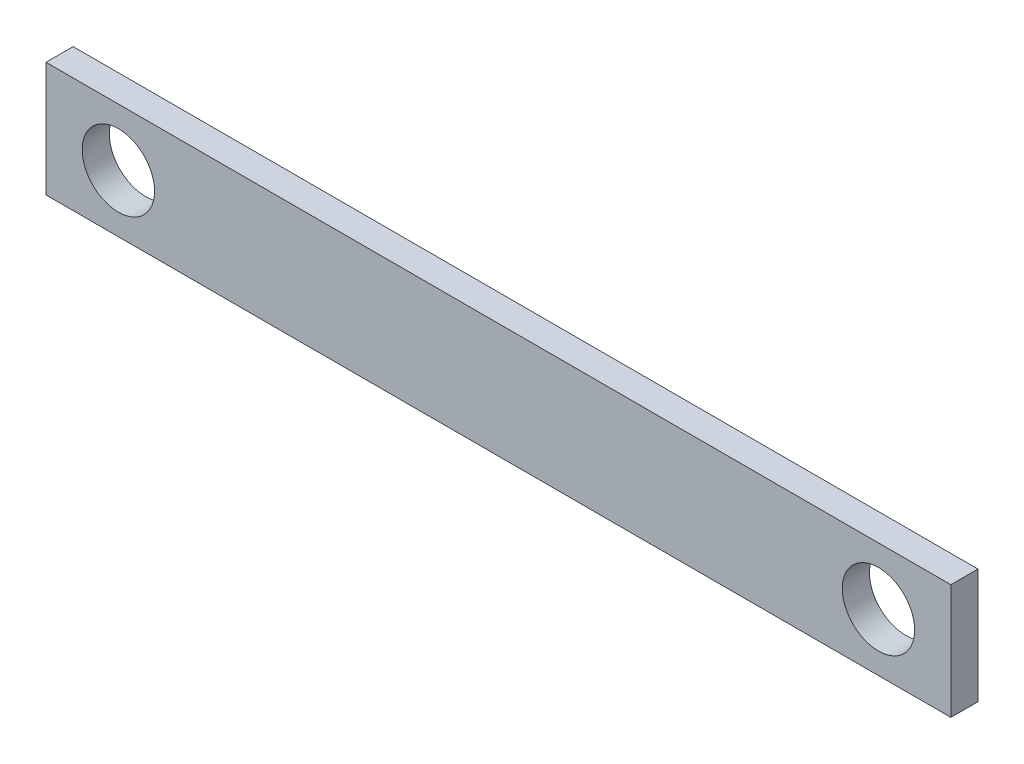
ISO-10303-21;
HEADER;
FILE_DESCRIPTION(('STEP AP214'),'2;1');
FILE_NAME('part.step','',(''),(''),'','','');
FILE_SCHEMA(('AUTOMOTIVE_DESIGN { 1 0 10303 214 1 1 1 1 }'));
ENDSEC;
DATA;
#1=APPLICATION_CONTEXT('core data for automotive mechanical design processes');
#2=APPLICATION_PROTOCOL_DEFINITION('international standard','automotive_design',2000,#1);
#3=PRODUCT_CONTEXT('',#1,'mechanical');
#4=PRODUCT('Part','Part','',(#3));
#5=PRODUCT_RELATED_PRODUCT_CATEGORY('part','',(#4));
#6=PRODUCT_DEFINITION_FORMATION('','',#4);
#7=PRODUCT_DEFINITION_CONTEXT('part definition',#1,'design');
#8=PRODUCT_DEFINITION('design','',#6,#7);
#9=PRODUCT_DEFINITION_SHAPE('','',#8);
#10=(LENGTH_UNIT() NAMED_UNIT(*) SI_UNIT(.MILLI.,.METRE.));
#11=(NAMED_UNIT(*) PLANE_ANGLE_UNIT() SI_UNIT($,.RADIAN.));
#12=(NAMED_UNIT(*) SI_UNIT($,.STERADIAN.) SOLID_ANGLE_UNIT());
#13=UNCERTAINTY_MEASURE_WITH_UNIT(LENGTH_MEASURE(1.E-05),#10,'distance_accuracy_value','');
#14=(GEOMETRIC_REPRESENTATION_CONTEXT(3) GLOBAL_UNCERTAINTY_ASSIGNED_CONTEXT((#13)) GLOBAL_UNIT_ASSIGNED_CONTEXT((#10,
#11,#12)) REPRESENTATION_CONTEXT('',''));
#15=CARTESIAN_POINT('',(0.,0.,0.));
#16=DIRECTION('',(0.,0.,1.));
#17=DIRECTION('',(1.,0.,0.));
#18=AXIS2_PLACEMENT_3D('',#15,#16,#17);
#19=CARTESIAN_POINT('',(0.,0.,3.));
#20=DIRECTION('',(0.,0.,1.));
#21=DIRECTION('',(1.,0.,0.));
#22=AXIS2_PLACEMENT_3D('',#19,#20,#21);
#23=PLANE('',#22);
#24=CARTESIAN_POINT('',(-42.,0.,3.));
#25=DIRECTION('',(0.,0.,1.));
#26=DIRECTION('',(1.,0.,0.));
#27=AXIS2_PLACEMENT_3D('',#24,#25,#26);
#28=CIRCLE('',#27,4.00000000000001);
#29=CARTESIAN_POINT('',(-38.,0.,3.));
#30=VERTEX_POINT('',#29);
#31=EDGE_CURVE('E100',#30,#30,#28,.T.);
#32=ORIENTED_EDGE('',*,*,#31,.F.);
#33=EDGE_LOOP('',(#32));
#34=FACE_BOUND('',#33,.T.);
#35=DIRECTION('',(0.,-1.,0.));
#36=VECTOR('',#35,1.);
#37=CARTESIAN_POINT('',(-50.,-6.35000000000001,3.));
#38=LINE('',#37,#36);
#39=CARTESIAN_POINT('',(-50.,6.34999999999999,3.));
#40=VERTEX_POINT('',#39);
#41=CARTESIAN_POINT('',(-50.,-6.35000000000001,3.));
#42=VERTEX_POINT('',#41);
#43=EDGE_CURVE('E85',#40,#42,#38,.T.);
#44=ORIENTED_EDGE('',*,*,#43,.T.);
#45=DIRECTION('',(1.,0.,0.));
#46=VECTOR('',#45,1.);
#47=CARTESIAN_POINT('',(50.,-6.34999999999999,3.));
#48=LINE('',#47,#46);
#49=CARTESIAN_POINT('',(50.,-6.34999999999999,3.));
#50=VERTEX_POINT('',#49);
#51=EDGE_CURVE('E80',#42,#50,#48,.T.);
#52=ORIENTED_EDGE('',*,*,#51,.T.);
#53=DIRECTION('',(0.,1.,0.));
#54=VECTOR('',#53,1.);
#55=CARTESIAN_POINT('',(50.,-6.34999999999999,3.));
#56=LINE('',#55,#54);
#57=CARTESIAN_POINT('',(50.,6.35000000000001,3.));
#58=VERTEX_POINT('',#57);
#59=EDGE_CURVE('E83',#50,#58,#56,.T.);
#60=ORIENTED_EDGE('',*,*,#59,.T.);
#61=DIRECTION('',(-1.,0.,0.));
#62=VECTOR('',#61,1.);
#63=CARTESIAN_POINT('',(50.,6.35000000000001,3.));
#64=LINE('',#63,#62);
#65=EDGE_CURVE('E50',#58,#40,#64,.T.);
#66=ORIENTED_EDGE('',*,*,#65,.T.);
#67=EDGE_LOOP('',(#44,#52,#60,#66));
#68=FACE_BOUND('',#67,.T.);
#69=CARTESIAN_POINT('',(42.,0.,3.));
#70=DIRECTION('',(0.,0.,1.));
#71=DIRECTION('',(-1.,0.,0.));
#72=AXIS2_PLACEMENT_3D('',#69,#70,#71);
#73=CIRCLE('',#72,4.00000000000001);
#74=CARTESIAN_POINT('',(38.,0.,3.));
#75=VERTEX_POINT('',#74);
#76=EDGE_CURVE('E115',#75,#75,#73,.T.);
#77=ORIENTED_EDGE('',*,*,#76,.F.);
#78=EDGE_LOOP('',(#77));
#79=FACE_BOUND('',#78,.T.);
#80=ADVANCED_FACE('F33',(#34,#68,#79),#23,.T.);
#81=CARTESIAN_POINT('',(0.,0.,0.));
#82=DIRECTION('',(0.,0.,1.));
#83=DIRECTION('',(1.,0.,0.));
#84=AXIS2_PLACEMENT_3D('',#81,#82,#83);
#85=PLANE('',#84);
#86=DIRECTION('',(0.,-1.,0.));
#87=VECTOR('',#86,1.);
#88=CARTESIAN_POINT('',(-50.,-6.35000000000001,0.));
#89=LINE('',#88,#87);
#90=CARTESIAN_POINT('',(-50.,6.34999999999999,0.));
#91=VERTEX_POINT('',#90);
#92=CARTESIAN_POINT('',(-50.,-6.35000000000001,0.));
#93=VERTEX_POINT('',#92);
#94=EDGE_CURVE('E97',#91,#93,#89,.T.);
#95=ORIENTED_EDGE('',*,*,#94,.F.);
#96=DIRECTION('',(-1.,0.,0.));
#97=VECTOR('',#96,1.);
#98=CARTESIAN_POINT('',(50.,6.35000000000001,0.));
#99=LINE('',#98,#97);
#100=CARTESIAN_POINT('',(50.,6.35000000000001,0.));
#101=VERTEX_POINT('',#100);
#102=EDGE_CURVE('E73',#101,#91,#99,.T.);
#103=ORIENTED_EDGE('',*,*,#102,.F.);
#104=DIRECTION('',(0.,1.,0.));
#105=VECTOR('',#104,1.);
#106=CARTESIAN_POINT('',(50.,-6.34999999999999,0.));
#107=LINE('',#106,#105);
#108=CARTESIAN_POINT('',(50.,-6.34999999999999,0.));
#109=VERTEX_POINT('',#108);
#110=EDGE_CURVE('E67',#109,#101,#107,.T.);
#111=ORIENTED_EDGE('',*,*,#110,.F.);
#112=DIRECTION('',(1.,0.,0.));
#113=VECTOR('',#112,1.);
#114=CARTESIAN_POINT('',(50.,-6.34999999999999,0.));
#115=LINE('',#114,#113);
#116=EDGE_CURVE('E89',#93,#109,#115,.T.);
#117=ORIENTED_EDGE('',*,*,#116,.F.);
#118=EDGE_LOOP('',(#95,#103,#111,#117));
#119=FACE_BOUND('',#118,.T.);
#120=CARTESIAN_POINT('',(-42.,0.,0.));
#121=DIRECTION('',(0.,0.,1.));
#122=DIRECTION('',(1.,0.,0.));
#123=AXIS2_PLACEMENT_3D('',#120,#121,#122);
#124=CIRCLE('',#123,4.00000000000001);
#125=CARTESIAN_POINT('',(-38.,0.,0.));
#126=VERTEX_POINT('',#125);
#127=EDGE_CURVE('E112',#126,#126,#124,.T.);
#128=ORIENTED_EDGE('',*,*,#127,.T.);
#129=EDGE_LOOP('',(#128));
#130=FACE_BOUND('',#129,.T.);
#131=CARTESIAN_POINT('',(42.,0.,0.));
#132=DIRECTION('',(0.,0.,1.));
#133=DIRECTION('',(-1.,0.,0.));
#134=AXIS2_PLACEMENT_3D('',#131,#132,#133);
#135=CIRCLE('',#134,4.00000000000001);
#136=CARTESIAN_POINT('',(38.,0.,0.));
#137=VERTEX_POINT('',#136);
#138=EDGE_CURVE('E118',#137,#137,#135,.T.);
#139=ORIENTED_EDGE('',*,*,#138,.T.);
#140=EDGE_LOOP('',(#139));
#141=FACE_BOUND('',#140,.T.);
#142=ADVANCED_FACE('F108',(#119,#130,#141),#85,.F.);
#143=CARTESIAN_POINT('',(-50.,-6.35000000000001,3.));
#144=DIRECTION('',(1.,0.,0.));
#145=DIRECTION('',(0.,0.,-1.));
#146=AXIS2_PLACEMENT_3D('',#143,#144,#145);
#147=PLANE('',#146);
#148=ORIENTED_EDGE('',*,*,#94,.T.);
#149=DIRECTION('',(0.,0.,-1.));
#150=VECTOR('',#149,1.);
#151=CARTESIAN_POINT('',(-50.,-6.35000000000001,3.));
#152=LINE('',#151,#150);
#153=EDGE_CURVE('E11',#42,#93,#152,.T.);
#154=ORIENTED_EDGE('',*,*,#153,.F.);
#155=ORIENTED_EDGE('',*,*,#43,.F.);
#156=DIRECTION('',(0.,0.,-1.));
#157=VECTOR('',#156,1.);
#158=CARTESIAN_POINT('',(-50.,6.34999999999999,3.));
#159=LINE('',#158,#157);
#160=EDGE_CURVE('E93',#40,#91,#159,.T.);
#161=ORIENTED_EDGE('',*,*,#160,.T.);
#162=EDGE_LOOP('',(#148,#154,#155,#161));
#163=FACE_BOUND('',#162,.T.);
#164=ADVANCED_FACE('F35',(#163),#147,.F.);
#165=CARTESIAN_POINT('',(50.,-6.34999999999999,3.));
#166=DIRECTION('',(0.,1.,0.));
#167=DIRECTION('',(-1.,0.,0.));
#168=AXIS2_PLACEMENT_3D('',#165,#166,#167);
#169=PLANE('',#168);
#170=ORIENTED_EDGE('',*,*,#116,.T.);
#171=DIRECTION('',(0.,0.,-1.));
#172=VECTOR('',#171,1.);
#173=CARTESIAN_POINT('',(50.,-6.34999999999999,3.));
#174=LINE('',#173,#172);
#175=EDGE_CURVE('E42',#50,#109,#174,.T.);
#176=ORIENTED_EDGE('',*,*,#175,.F.);
#177=ORIENTED_EDGE('',*,*,#51,.F.);
#178=ORIENTED_EDGE('',*,*,#153,.T.);
#179=EDGE_LOOP('',(#170,#176,#177,#178));
#180=FACE_BOUND('',#179,.T.);
#181=ADVANCED_FACE('F88',(#180),#169,.F.);
#182=CARTESIAN_POINT('',(50.,-6.34999999999999,3.));
#183=DIRECTION('',(-1.,0.,0.));
#184=DIRECTION('',(0.,0.,1.));
#185=AXIS2_PLACEMENT_3D('',#182,#183,#184);
#186=PLANE('',#185);
#187=ORIENTED_EDGE('',*,*,#110,.T.);
#188=DIRECTION('',(0.,0.,-1.));
#189=VECTOR('',#188,1.);
#190=CARTESIAN_POINT('',(50.,6.35000000000001,3.));
#191=LINE('',#190,#189);
#192=EDGE_CURVE('E90',#58,#101,#191,.T.);
#193=ORIENTED_EDGE('',*,*,#192,.F.);
#194=ORIENTED_EDGE('',*,*,#59,.F.);
#195=ORIENTED_EDGE('',*,*,#175,.T.);
#196=EDGE_LOOP('',(#187,#193,#194,#195));
#197=FACE_BOUND('',#196,.T.);
#198=ADVANCED_FACE('F91',(#197),#186,.F.);
#199=CARTESIAN_POINT('',(50.,6.35000000000001,3.));
#200=DIRECTION('',(0.,-1.,0.));
#201=DIRECTION('',(1.,0.,0.));
#202=AXIS2_PLACEMENT_3D('',#199,#200,#201);
#203=PLANE('',#202);
#204=ORIENTED_EDGE('',*,*,#102,.T.);
#205=ORIENTED_EDGE('',*,*,#160,.F.);
#206=ORIENTED_EDGE('',*,*,#65,.F.);
#207=ORIENTED_EDGE('',*,*,#192,.T.);
#208=EDGE_LOOP('',(#204,#205,#206,#207));
#209=FACE_BOUND('',#208,.T.);
#210=ADVANCED_FACE('F105',(#209),#203,.F.);
#211=CARTESIAN_POINT('',(-42.,0.,3.));
#212=DIRECTION('',(0.,0.,-1.));
#213=DIRECTION('',(-1.,0.,0.));
#214=AXIS2_PLACEMENT_3D('',#211,#212,#213);
#215=CYLINDRICAL_SURFACE('',#214,4.00000000000001);
#216=ORIENTED_EDGE('',*,*,#31,.T.);
#217=EDGE_LOOP('',(#216));
#218=FACE_BOUND('',#217,.T.);
#219=ORIENTED_EDGE('',*,*,#127,.F.);
#220=EDGE_LOOP('',(#219));
#221=FACE_BOUND('',#220,.T.);
#222=ADVANCED_FACE('F135',(#218,#221),#215,.F.);
#223=CARTESIAN_POINT('',(42.,0.,3.));
#224=DIRECTION('',(0.,0.,-1.));
#225=DIRECTION('',(-1.,0.,0.));
#226=AXIS2_PLACEMENT_3D('',#223,#224,#225);
#227=CYLINDRICAL_SURFACE('',#226,4.00000000000001);
#228=ORIENTED_EDGE('',*,*,#76,.T.);
#229=EDGE_LOOP('',(#228));
#230=FACE_BOUND('',#229,.T.);
#231=ORIENTED_EDGE('',*,*,#138,.F.);
#232=EDGE_LOOP('',(#231));
#233=FACE_BOUND('',#232,.T.);
#234=ADVANCED_FACE('F124',(#230,#233),#227,.F.);
#235=CLOSED_SHELL('',(#80,#142,#164,#181,#198,#210,#222,#234));
#236=MANIFOLD_SOLID_BREP('B2',#235);
#237=ADVANCED_BREP_SHAPE_REPRESENTATION('',(#18,#236),#14);
#238=SHAPE_DEFINITION_REPRESENTATION(#9,#237);
ENDSEC;
END-ISO-10303-21;
